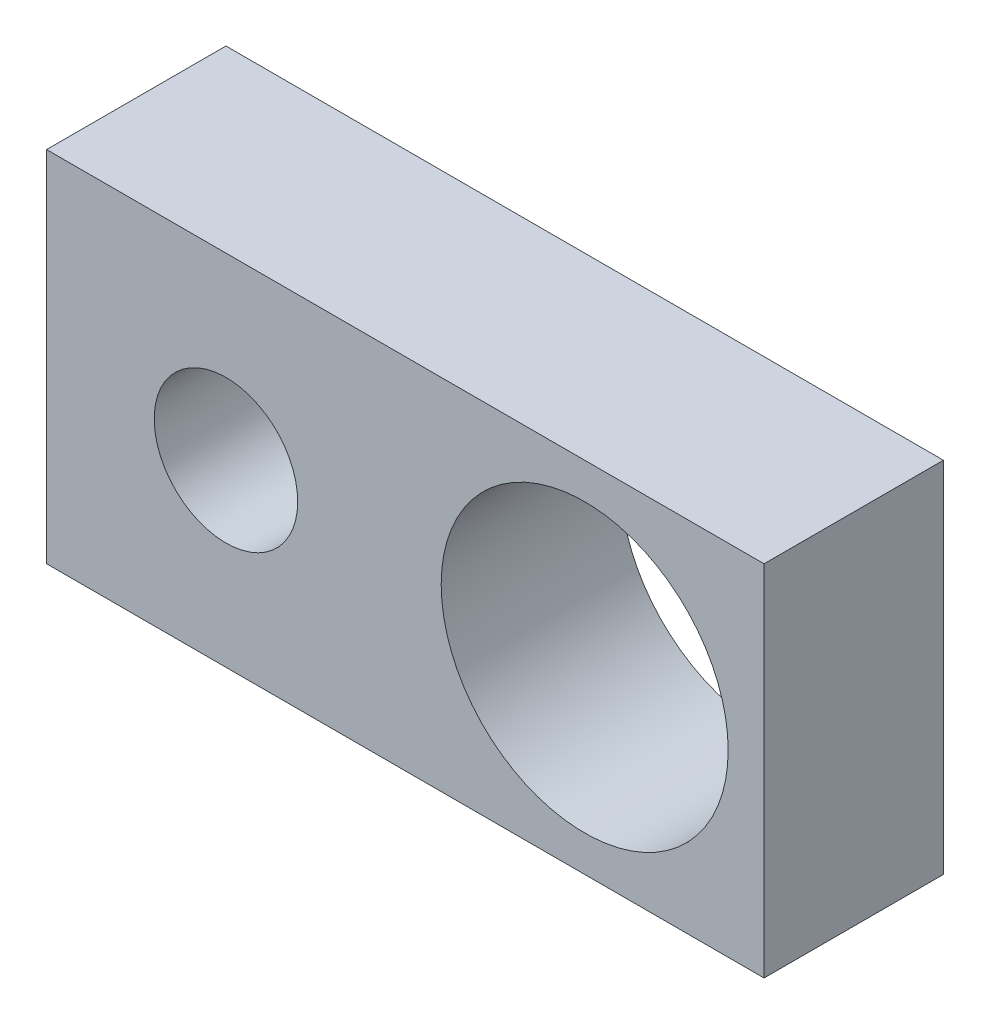
ISO-10303-21;
HEADER;
FILE_DESCRIPTION(('STEP AP214'),'2;1');
FILE_NAME('part.step','',(''),(''),'','','');
FILE_SCHEMA(('AUTOMOTIVE_DESIGN { 1 0 10303 214 1 1 1 1 }'));
ENDSEC;
DATA;
#1=APPLICATION_CONTEXT('core data for automotive mechanical design processes');
#2=APPLICATION_PROTOCOL_DEFINITION('international standard','automotive_design',2000,#1);
#3=PRODUCT_CONTEXT('',#1,'mechanical');
#4=PRODUCT('Part','Part','',(#3));
#5=PRODUCT_RELATED_PRODUCT_CATEGORY('part','',(#4));
#6=PRODUCT_DEFINITION_FORMATION('','',#4);
#7=PRODUCT_DEFINITION_CONTEXT('part definition',#1,'design');
#8=PRODUCT_DEFINITION('design','',#6,#7);
#9=PRODUCT_DEFINITION_SHAPE('','',#8);
#10=(LENGTH_UNIT() NAMED_UNIT(*) SI_UNIT(.MILLI.,.METRE.));
#11=(NAMED_UNIT(*) PLANE_ANGLE_UNIT() SI_UNIT($,.RADIAN.));
#12=(NAMED_UNIT(*) SI_UNIT($,.STERADIAN.) SOLID_ANGLE_UNIT());
#13=UNCERTAINTY_MEASURE_WITH_UNIT(LENGTH_MEASURE(1.E-05),#10,'distance_accuracy_value','');
#14=(GEOMETRIC_REPRESENTATION_CONTEXT(3) GLOBAL_UNCERTAINTY_ASSIGNED_CONTEXT((#13)) GLOBAL_UNIT_ASSIGNED_CONTEXT((#10,
#11,#12)) REPRESENTATION_CONTEXT('',''));
#15=CARTESIAN_POINT('',(0.,0.,0.));
#16=DIRECTION('',(0.,0.,1.));
#17=DIRECTION('',(1.,0.,0.));
#18=AXIS2_PLACEMENT_3D('',#15,#16,#17);
#19=CARTESIAN_POINT('',(0.,0.,10.));
#20=DIRECTION('',(0.,0.,1.));
#21=DIRECTION('',(1.,0.,0.));
#22=AXIS2_PLACEMENT_3D('',#19,#20,#21);
#23=PLANE('',#22);
#24=CARTESIAN_POINT('',(-10.,0.,10.));
#25=DIRECTION('',(0.,0.,1.));
#26=DIRECTION('',(1.,0.,0.));
#27=AXIS2_PLACEMENT_3D('',#24,#25,#26);
#28=CIRCLE('',#27,4.);
#29=CARTESIAN_POINT('',(-6.,0.,10.));
#30=VERTEX_POINT('',#29);
#31=EDGE_CURVE('E99',#30,#30,#28,.T.);
#32=ORIENTED_EDGE('',*,*,#31,.F.);
#33=EDGE_LOOP('',(#32));
#34=FACE_BOUND('',#33,.T.);
#35=DIRECTION('',(0.,-1.,0.));
#36=VECTOR('',#35,1.);
#37=CARTESIAN_POINT('',(-20.,-10.,10.));
#38=LINE('',#37,#36);
#39=CARTESIAN_POINT('',(-20.,10.,10.));
#40=VERTEX_POINT('',#39);
#41=CARTESIAN_POINT('',(-20.,-10.,10.));
#42=VERTEX_POINT('',#41);
#43=EDGE_CURVE('E84',#40,#42,#38,.T.);
#44=ORIENTED_EDGE('',*,*,#43,.T.);
#45=DIRECTION('',(1.,0.,0.));
#46=VECTOR('',#45,1.);
#47=CARTESIAN_POINT('',(20.,-10.,10.));
#48=LINE('',#47,#46);
#49=CARTESIAN_POINT('',(20.,-10.,10.));
#50=VERTEX_POINT('',#49);
#51=EDGE_CURVE('E79',#42,#50,#48,.T.);
#52=ORIENTED_EDGE('',*,*,#51,.T.);
#53=DIRECTION('',(0.,1.,0.));
#54=VECTOR('',#53,1.);
#55=CARTESIAN_POINT('',(20.,-10.,10.));
#56=LINE('',#55,#54);
#57=CARTESIAN_POINT('',(20.,10.,10.));
#58=VERTEX_POINT('',#57);
#59=EDGE_CURVE('E82',#50,#58,#56,.T.);
#60=ORIENTED_EDGE('',*,*,#59,.T.);
#61=DIRECTION('',(-1.,0.,0.));
#62=VECTOR('',#61,1.);
#63=CARTESIAN_POINT('',(20.,10.,10.));
#64=LINE('',#63,#62);
#65=EDGE_CURVE('E49',#58,#40,#64,.T.);
#66=ORIENTED_EDGE('',*,*,#65,.T.);
#67=EDGE_LOOP('',(#44,#52,#60,#66));
#68=FACE_BOUND('',#67,.T.);
#69=CARTESIAN_POINT('',(10.,0.,10.));
#70=DIRECTION('',(0.,0.,1.));
#71=DIRECTION('',(1.,0.,0.));
#72=AXIS2_PLACEMENT_3D('',#69,#70,#71);
#73=CIRCLE('',#72,8.);
#74=CARTESIAN_POINT('',(18.,0.,10.));
#75=VERTEX_POINT('',#74);
#76=EDGE_CURVE('E114',#75,#75,#73,.T.);
#77=ORIENTED_EDGE('',*,*,#76,.F.);
#78=EDGE_LOOP('',(#77));
#79=FACE_BOUND('',#78,.T.);
#80=ADVANCED_FACE('F32',(#34,#68,#79),#23,.T.);
#81=CARTESIAN_POINT('',(0.,0.,0.));
#82=DIRECTION('',(0.,0.,1.));
#83=DIRECTION('',(1.,0.,0.));
#84=AXIS2_PLACEMENT_3D('',#81,#82,#83);
#85=PLANE('',#84);
#86=DIRECTION('',(0.,-1.,0.));
#87=VECTOR('',#86,1.);
#88=CARTESIAN_POINT('',(-20.,-10.,0.));
#89=LINE('',#88,#87);
#90=CARTESIAN_POINT('',(-20.,10.,0.));
#91=VERTEX_POINT('',#90);
#92=CARTESIAN_POINT('',(-20.,-10.,0.));
#93=VERTEX_POINT('',#92);
#94=EDGE_CURVE('E96',#91,#93,#89,.T.);
#95=ORIENTED_EDGE('',*,*,#94,.F.);
#96=DIRECTION('',(-1.,0.,0.));
#97=VECTOR('',#96,1.);
#98=CARTESIAN_POINT('',(20.,10.,0.));
#99=LINE('',#98,#97);
#100=CARTESIAN_POINT('',(20.,10.,0.));
#101=VERTEX_POINT('',#100);
#102=EDGE_CURVE('E72',#101,#91,#99,.T.);
#103=ORIENTED_EDGE('',*,*,#102,.F.);
#104=DIRECTION('',(0.,1.,0.));
#105=VECTOR('',#104,1.);
#106=CARTESIAN_POINT('',(20.,-10.,0.));
#107=LINE('',#106,#105);
#108=CARTESIAN_POINT('',(20.,-10.,0.));
#109=VERTEX_POINT('',#108);
#110=EDGE_CURVE('E66',#109,#101,#107,.T.);
#111=ORIENTED_EDGE('',*,*,#110,.F.);
#112=DIRECTION('',(1.,0.,0.));
#113=VECTOR('',#112,1.);
#114=CARTESIAN_POINT('',(20.,-10.,0.));
#115=LINE('',#114,#113);
#116=EDGE_CURVE('E88',#93,#109,#115,.T.);
#117=ORIENTED_EDGE('',*,*,#116,.F.);
#118=EDGE_LOOP('',(#95,#103,#111,#117));
#119=FACE_BOUND('',#118,.T.);
#120=CARTESIAN_POINT('',(-10.,0.,0.));
#121=DIRECTION('',(0.,0.,1.));
#122=DIRECTION('',(1.,0.,0.));
#123=AXIS2_PLACEMENT_3D('',#120,#121,#122);
#124=CIRCLE('',#123,4.);
#125=CARTESIAN_POINT('',(-6.,0.,0.));
#126=VERTEX_POINT('',#125);
#127=EDGE_CURVE('E111',#126,#126,#124,.T.);
#128=ORIENTED_EDGE('',*,*,#127,.T.);
#129=EDGE_LOOP('',(#128));
#130=FACE_BOUND('',#129,.T.);
#131=CARTESIAN_POINT('',(10.,0.,0.));
#132=DIRECTION('',(0.,0.,1.));
#133=DIRECTION('',(1.,0.,0.));
#134=AXIS2_PLACEMENT_3D('',#131,#132,#133);
#135=CIRCLE('',#134,8.);
#136=CARTESIAN_POINT('',(18.,0.,0.));
#137=VERTEX_POINT('',#136);
#138=EDGE_CURVE('E117',#137,#137,#135,.T.);
#139=ORIENTED_EDGE('',*,*,#138,.T.);
#140=EDGE_LOOP('',(#139));
#141=FACE_BOUND('',#140,.T.);
#142=ADVANCED_FACE('F107',(#119,#130,#141),#85,.F.);
#143=CARTESIAN_POINT('',(-20.,-10.,10.));
#144=DIRECTION('',(1.,0.,0.));
#145=DIRECTION('',(0.,0.,-1.));
#146=AXIS2_PLACEMENT_3D('',#143,#144,#145);
#147=PLANE('',#146);
#148=ORIENTED_EDGE('',*,*,#94,.T.);
#149=DIRECTION('',(0.,0.,-1.));
#150=VECTOR('',#149,1.);
#151=CARTESIAN_POINT('',(-20.,-10.,10.));
#152=LINE('',#151,#150);
#153=EDGE_CURVE('E11',#42,#93,#152,.T.);
#154=ORIENTED_EDGE('',*,*,#153,.F.);
#155=ORIENTED_EDGE('',*,*,#43,.F.);
#156=DIRECTION('',(0.,0.,-1.));
#157=VECTOR('',#156,1.);
#158=CARTESIAN_POINT('',(-20.,10.,10.));
#159=LINE('',#158,#157);
#160=EDGE_CURVE('E92',#40,#91,#159,.T.);
#161=ORIENTED_EDGE('',*,*,#160,.T.);
#162=EDGE_LOOP('',(#148,#154,#155,#161));
#163=FACE_BOUND('',#162,.T.);
#164=ADVANCED_FACE('F34',(#163),#147,.F.);
#165=CARTESIAN_POINT('',(20.,-10.,10.));
#166=DIRECTION('',(0.,1.,0.));
#167=DIRECTION('',(-1.,0.,0.));
#168=AXIS2_PLACEMENT_3D('',#165,#166,#167);
#169=PLANE('',#168);
#170=ORIENTED_EDGE('',*,*,#116,.T.);
#171=DIRECTION('',(0.,0.,-1.));
#172=VECTOR('',#171,1.);
#173=CARTESIAN_POINT('',(20.,-10.,10.));
#174=LINE('',#173,#172);
#175=EDGE_CURVE('E41',#50,#109,#174,.T.);
#176=ORIENTED_EDGE('',*,*,#175,.F.);
#177=ORIENTED_EDGE('',*,*,#51,.F.);
#178=ORIENTED_EDGE('',*,*,#153,.T.);
#179=EDGE_LOOP('',(#170,#176,#177,#178));
#180=FACE_BOUND('',#179,.T.);
#181=ADVANCED_FACE('F87',(#180),#169,.F.);
#182=CARTESIAN_POINT('',(20.,-10.,10.));
#183=DIRECTION('',(-1.,0.,0.));
#184=DIRECTION('',(0.,0.,1.));
#185=AXIS2_PLACEMENT_3D('',#182,#183,#184);
#186=PLANE('',#185);
#187=ORIENTED_EDGE('',*,*,#110,.T.);
#188=DIRECTION('',(0.,0.,-1.));
#189=VECTOR('',#188,1.);
#190=CARTESIAN_POINT('',(20.,10.,10.));
#191=LINE('',#190,#189);
#192=EDGE_CURVE('E89',#58,#101,#191,.T.);
#193=ORIENTED_EDGE('',*,*,#192,.F.);
#194=ORIENTED_EDGE('',*,*,#59,.F.);
#195=ORIENTED_EDGE('',*,*,#175,.T.);
#196=EDGE_LOOP('',(#187,#193,#194,#195));
#197=FACE_BOUND('',#196,.T.);
#198=ADVANCED_FACE('F90',(#197),#186,.F.);
#199=CARTESIAN_POINT('',(20.,10.,10.));
#200=DIRECTION('',(0.,-1.,0.));
#201=DIRECTION('',(1.,0.,0.));
#202=AXIS2_PLACEMENT_3D('',#199,#200,#201);
#203=PLANE('',#202);
#204=ORIENTED_EDGE('',*,*,#102,.T.);
#205=ORIENTED_EDGE('',*,*,#160,.F.);
#206=ORIENTED_EDGE('',*,*,#65,.F.);
#207=ORIENTED_EDGE('',*,*,#192,.T.);
#208=EDGE_LOOP('',(#204,#205,#206,#207));
#209=FACE_BOUND('',#208,.T.);
#210=ADVANCED_FACE('F104',(#209),#203,.F.);
#211=CARTESIAN_POINT('',(-10.,0.,10.));
#212=DIRECTION('',(0.,0.,-1.));
#213=DIRECTION('',(-1.,0.,0.));
#214=AXIS2_PLACEMENT_3D('',#211,#212,#213);
#215=CYLINDRICAL_SURFACE('',#214,4.);
#216=ORIENTED_EDGE('',*,*,#31,.T.);
#217=EDGE_LOOP('',(#216));
#218=FACE_BOUND('',#217,.T.);
#219=ORIENTED_EDGE('',*,*,#127,.F.);
#220=EDGE_LOOP('',(#219));
#221=FACE_BOUND('',#220,.T.);
#222=ADVANCED_FACE('F134',(#218,#221),#215,.F.);
#223=CARTESIAN_POINT('',(10.,0.,10.));
#224=DIRECTION('',(0.,0.,-1.));
#225=DIRECTION('',(-1.,0.,0.));
#226=AXIS2_PLACEMENT_3D('',#223,#224,#225);
#227=CYLINDRICAL_SURFACE('',#226,8.);
#228=ORIENTED_EDGE('',*,*,#76,.T.);
#229=EDGE_LOOP('',(#228));
#230=FACE_BOUND('',#229,.T.);
#231=ORIENTED_EDGE('',*,*,#138,.F.);
#232=EDGE_LOOP('',(#231));
#233=FACE_BOUND('',#232,.T.);
#234=ADVANCED_FACE('F123',(#230,#233),#227,.F.);
#235=CLOSED_SHELL('',(#80,#142,#164,#181,#198,#210,#222,#234));
#236=MANIFOLD_SOLID_BREP('B2',#235);
#237=ADVANCED_BREP_SHAPE_REPRESENTATION('',(#18,#236),#14);
#238=SHAPE_DEFINITION_REPRESENTATION(#9,#237);
ENDSEC;
END-ISO-10303-21;
